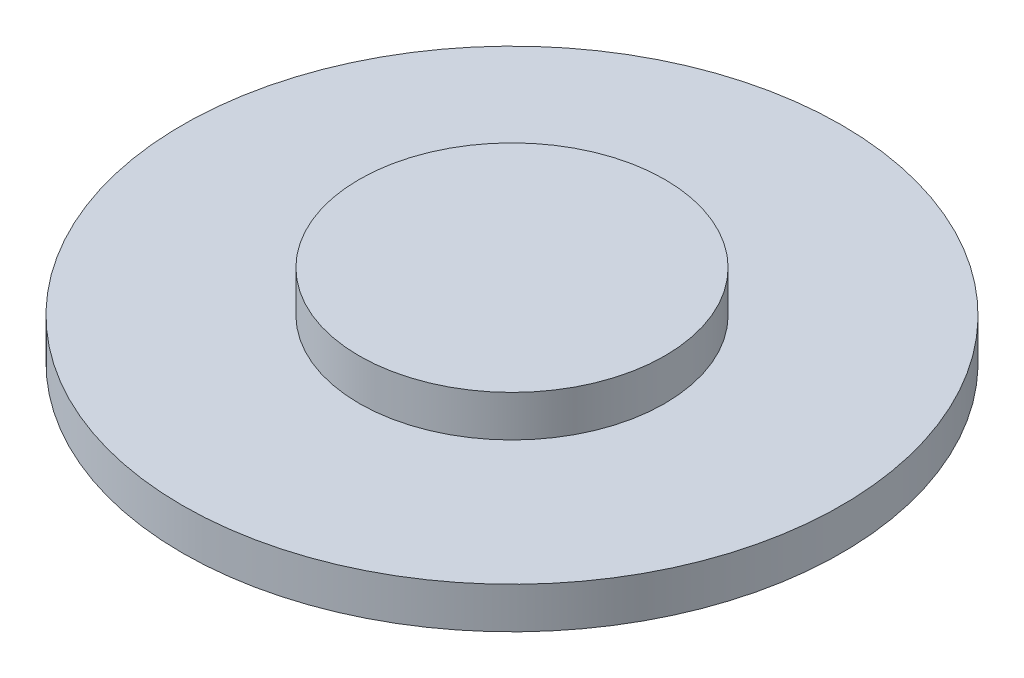
ISO-10303-21;
HEADER;
FILE_DESCRIPTION(('STEP AP214'),'2;1');
FILE_NAME('part.step','',(''),(''),'','','');
FILE_SCHEMA(('AUTOMOTIVE_DESIGN { 1 0 10303 214 1 1 1 1 }'));
ENDSEC;
DATA;
#1=APPLICATION_CONTEXT('core data for automotive mechanical design processes');
#2=APPLICATION_PROTOCOL_DEFINITION('international standard','automotive_design',2000,#1);
#3=PRODUCT_CONTEXT('',#1,'mechanical');
#4=PRODUCT('Part','Part','',(#3));
#5=PRODUCT_RELATED_PRODUCT_CATEGORY('part','',(#4));
#6=PRODUCT_DEFINITION_FORMATION('','',#4);
#7=PRODUCT_DEFINITION_CONTEXT('part definition',#1,'design');
#8=PRODUCT_DEFINITION('design','',#6,#7);
#9=PRODUCT_DEFINITION_SHAPE('','',#8);
#10=(LENGTH_UNIT() NAMED_UNIT(*) SI_UNIT(.MILLI.,.METRE.));
#11=(NAMED_UNIT(*) PLANE_ANGLE_UNIT() SI_UNIT($,.RADIAN.));
#12=(NAMED_UNIT(*) SI_UNIT($,.STERADIAN.) SOLID_ANGLE_UNIT());
#13=UNCERTAINTY_MEASURE_WITH_UNIT(LENGTH_MEASURE(1.E-05),#10,'distance_accuracy_value','');
#14=(GEOMETRIC_REPRESENTATION_CONTEXT(3) GLOBAL_UNCERTAINTY_ASSIGNED_CONTEXT((#13)) GLOBAL_UNIT_ASSIGNED_CONTEXT((#10,
#11,#12)) REPRESENTATION_CONTEXT('',''));
#15=CARTESIAN_POINT('',(0.,0.,0.));
#16=DIRECTION('',(0.,0.,1.));
#17=DIRECTION('',(1.,0.,0.));
#18=AXIS2_PLACEMENT_3D('',#15,#16,#17);
#19=CARTESIAN_POINT('',(0.,-5.,0.));
#20=DIRECTION('',(0.,1.,0.));
#21=DIRECTION('',(0.,0.,1.));
#22=AXIS2_PLACEMENT_3D('',#19,#20,#21);
#23=CYLINDRICAL_SURFACE('',#22,40.);
#24=CARTESIAN_POINT('',(0.,-5.,0.));
#25=DIRECTION('',(0.,1.,0.));
#26=DIRECTION('',(0.,0.,1.));
#27=AXIS2_PLACEMENT_3D('',#24,#25,#26);
#28=CIRCLE('',#27,40.);
#29=CARTESIAN_POINT('',(0.,-5.,40.));
#30=VERTEX_POINT('',#29);
#31=EDGE_CURVE('E10',#30,#30,#28,.T.);
#32=ORIENTED_EDGE('',*,*,#31,.T.);
#33=EDGE_LOOP('',(#32));
#34=FACE_BOUND('',#33,.T.);
#35=CARTESIAN_POINT('',(0.,0.,0.));
#36=DIRECTION('',(0.,1.,0.));
#37=DIRECTION('',(0.,0.,1.));
#38=AXIS2_PLACEMENT_3D('',#35,#36,#37);
#39=CIRCLE('',#38,40.);
#40=CARTESIAN_POINT('',(0.,0.,40.));
#41=VERTEX_POINT('',#40);
#42=EDGE_CURVE('E45',#41,#41,#39,.T.);
#43=ORIENTED_EDGE('',*,*,#42,.F.);
#44=EDGE_LOOP('',(#43));
#45=FACE_BOUND('',#44,.T.);
#46=ADVANCED_FACE('F31',(#34,#45),#23,.T.);
#47=CARTESIAN_POINT('',(40.,-5.,0.));
#48=DIRECTION('',(0.,-1.,0.));
#49=DIRECTION('',(0.,0.,-1.));
#50=AXIS2_PLACEMENT_3D('',#47,#48,#49);
#51=PLANE('',#50);
#52=ORIENTED_EDGE('',*,*,#31,.F.);
#53=EDGE_LOOP('',(#52));
#54=FACE_BOUND('',#53,.T.);
#55=ADVANCED_FACE('F55',(#54),#51,.T.);
#56=CARTESIAN_POINT('',(0.,5.,0.));
#57=DIRECTION('',(0.,1.,0.));
#58=DIRECTION('',(0.,0.,1.));
#59=AXIS2_PLACEMENT_3D('',#56,#57,#58);
#60=PLANE('',#59);
#61=CARTESIAN_POINT('',(0.,5.,0.));
#62=DIRECTION('',(0.,1.,0.));
#63=DIRECTION('',(0.,0.,1.));
#64=AXIS2_PLACEMENT_3D('',#61,#62,#63);
#65=CIRCLE('',#64,18.55);
#66=CARTESIAN_POINT('',(0.,5.,18.55));
#67=VERTEX_POINT('',#66);
#68=EDGE_CURVE('E37',#67,#67,#65,.T.);
#69=ORIENTED_EDGE('',*,*,#68,.T.);
#70=EDGE_LOOP('',(#69));
#71=FACE_BOUND('',#70,.T.);
#72=ADVANCED_FACE('F59',(#71),#60,.T.);
#73=CARTESIAN_POINT('',(0.,-5.,0.));
#74=DIRECTION('',(0.,1.,0.));
#75=DIRECTION('',(0.,0.,1.));
#76=AXIS2_PLACEMENT_3D('',#73,#74,#75);
#77=CYLINDRICAL_SURFACE('',#76,18.55);
#78=CARTESIAN_POINT('',(0.,0.,0.));
#79=DIRECTION('',(0.,1.,0.));
#80=DIRECTION('',(0.,0.,1.));
#81=AXIS2_PLACEMENT_3D('',#78,#79,#80);
#82=CIRCLE('',#81,18.55);
#83=CARTESIAN_POINT('',(0.,0.,18.55));
#84=VERTEX_POINT('',#83);
#85=EDGE_CURVE('E41',#84,#84,#82,.T.);
#86=ORIENTED_EDGE('',*,*,#85,.T.);
#87=EDGE_LOOP('',(#86));
#88=FACE_BOUND('',#87,.T.);
#89=ORIENTED_EDGE('',*,*,#68,.F.);
#90=EDGE_LOOP('',(#89));
#91=FACE_BOUND('',#90,.T.);
#92=ADVANCED_FACE('F64',(#88,#91),#77,.T.);
#93=CARTESIAN_POINT('',(18.55,0.,0.));
#94=DIRECTION('',(0.,1.,0.));
#95=DIRECTION('',(0.,0.,1.));
#96=AXIS2_PLACEMENT_3D('',#93,#94,#95);
#97=PLANE('',#96);
#98=ORIENTED_EDGE('',*,*,#42,.T.);
#99=EDGE_LOOP('',(#98));
#100=FACE_BOUND('',#99,.T.);
#101=ORIENTED_EDGE('',*,*,#85,.F.);
#102=EDGE_LOOP('',(#101));
#103=FACE_BOUND('',#102,.T.);
#104=ADVANCED_FACE('F51',(#100,#103),#97,.T.);
#105=CLOSED_SHELL('',(#46,#55,#72,#92,#104));
#106=MANIFOLD_SOLID_BREP('B2',#105);
#107=ADVANCED_BREP_SHAPE_REPRESENTATION('',(#18,#106),#14);
#108=SHAPE_DEFINITION_REPRESENTATION(#9,#107);
ENDSEC;
END-ISO-10303-21;
